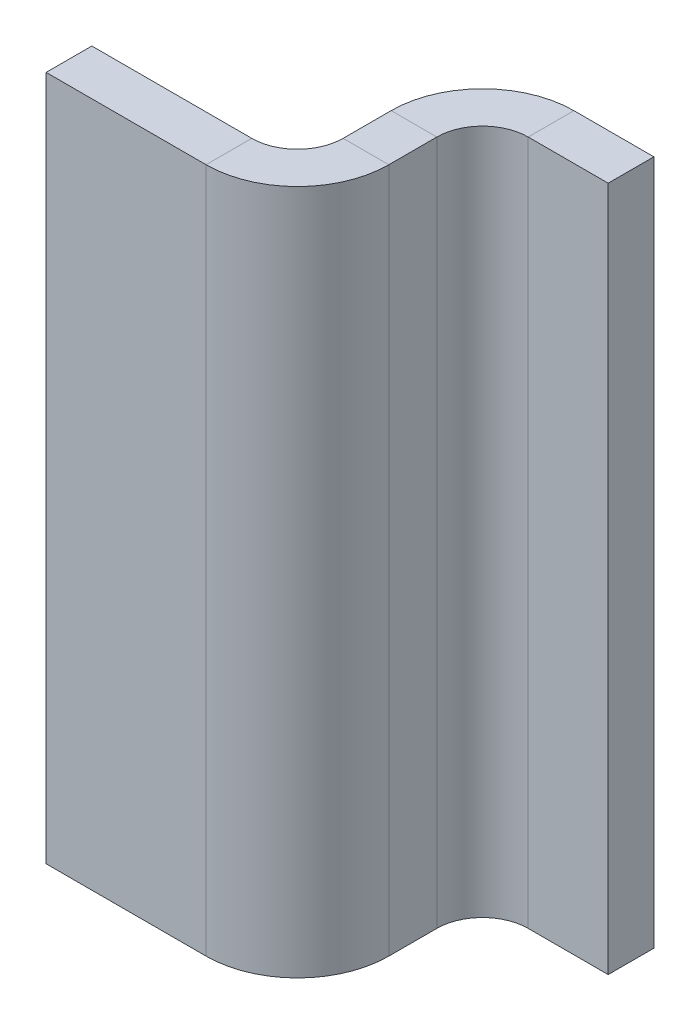
ISO-10303-21;
HEADER;
FILE_DESCRIPTION(('STEP AP214'),'2;1');
FILE_NAME('part.step','',(''),(''),'','','');
FILE_SCHEMA(('AUTOMOTIVE_DESIGN { 1 0 10303 214 1 1 1 1 }'));
ENDSEC;
DATA;
#1=APPLICATION_CONTEXT('core data for automotive mechanical design processes');
#2=APPLICATION_PROTOCOL_DEFINITION('international standard','automotive_design',2000,#1);
#3=PRODUCT_CONTEXT('',#1,'mechanical');
#4=PRODUCT('Part','Part','',(#3));
#5=PRODUCT_RELATED_PRODUCT_CATEGORY('part','',(#4));
#6=PRODUCT_DEFINITION_FORMATION('','',#4);
#7=PRODUCT_DEFINITION_CONTEXT('part definition',#1,'design');
#8=PRODUCT_DEFINITION('design','',#6,#7);
#9=PRODUCT_DEFINITION_SHAPE('','',#8);
#10=(LENGTH_UNIT() NAMED_UNIT(*) SI_UNIT(.MILLI.,.METRE.));
#11=(NAMED_UNIT(*) PLANE_ANGLE_UNIT() SI_UNIT($,.RADIAN.));
#12=(NAMED_UNIT(*) SI_UNIT($,.STERADIAN.) SOLID_ANGLE_UNIT());
#13=UNCERTAINTY_MEASURE_WITH_UNIT(LENGTH_MEASURE(1.E-05),#10,'distance_accuracy_value','');
#14=(GEOMETRIC_REPRESENTATION_CONTEXT(3) GLOBAL_UNCERTAINTY_ASSIGNED_CONTEXT((#13)) GLOBAL_UNIT_ASSIGNED_CONTEXT((#10,
#11,#12)) REPRESENTATION_CONTEXT('',''));
#15=CARTESIAN_POINT('',(0.,0.,0.));
#16=DIRECTION('',(0.,0.,1.));
#17=DIRECTION('',(1.,0.,0.));
#18=AXIS2_PLACEMENT_3D('',#15,#16,#17);
#19=CARTESIAN_POINT('',(0.,-1.5,0.81));
#20=DIRECTION('',(-1.,0.,0.));
#21=DIRECTION('',(0.,0.,-1.));
#22=AXIS2_PLACEMENT_3D('',#19,#20,#21);
#23=PLANE('',#22);
#24=DIRECTION('',(0.,0.,1.));
#25=VECTOR('',#24,1.);
#26=CARTESIAN_POINT('',(0.,-1.5,1.01));
#27=LINE('',#26,#25);
#28=CARTESIAN_POINT('',(0.,-1.5,0.81));
#29=VERTEX_POINT('',#28);
#30=CARTESIAN_POINT('',(0.,-1.5,1.01));
#31=VERTEX_POINT('',#30);
#32=EDGE_CURVE('E11',#29,#31,#27,.T.);
#33=ORIENTED_EDGE('',*,*,#32,.T.);
#34=DIRECTION('',(0.,1.,0.));
#35=VECTOR('',#34,1.);
#36=CARTESIAN_POINT('',(0.,1.5,1.01));
#37=LINE('',#36,#35);
#38=CARTESIAN_POINT('',(0.,1.5,1.01));
#39=VERTEX_POINT('',#38);
#40=EDGE_CURVE('E23',#31,#39,#37,.T.);
#41=ORIENTED_EDGE('',*,*,#40,.T.);
#42=DIRECTION('',(0.,0.,-1.));
#43=VECTOR('',#42,1.);
#44=CARTESIAN_POINT('',(0.,1.5,0.81));
#45=LINE('',#44,#43);
#46=CARTESIAN_POINT('',(0.,1.5,0.81));
#47=VERTEX_POINT('',#46);
#48=EDGE_CURVE('E216',#39,#47,#45,.T.);
#49=ORIENTED_EDGE('',*,*,#48,.T.);
#50=DIRECTION('',(0.,-1.,0.));
#51=VECTOR('',#50,1.);
#52=CARTESIAN_POINT('',(0.,-1.5,0.81));
#53=LINE('',#52,#51);
#54=EDGE_CURVE('E35',#47,#29,#53,.T.);
#55=ORIENTED_EDGE('',*,*,#54,.T.);
#56=EDGE_LOOP('',(#33,#41,#49,#55));
#57=FACE_BOUND('',#56,.T.);
#58=ADVANCED_FACE('F16',(#57),#23,.T.);
#59=CARTESIAN_POINT('',(0.,-1.5,0.81));
#60=DIRECTION('',(0.,0.,1.));
#61=DIRECTION('',(0.,-1.,0.));
#62=AXIS2_PLACEMENT_3D('',#59,#60,#61);
#63=PLANE('',#62);
#64=DIRECTION('',(0.,-1.,0.));
#65=VECTOR('',#64,1.);
#66=CARTESIAN_POINT('',(0.7,-1.5,0.81));
#67=LINE('',#66,#65);
#68=CARTESIAN_POINT('',(0.7,1.5,0.81));
#69=VERTEX_POINT('',#68);
#70=CARTESIAN_POINT('',(0.7,-1.5,0.81));
#71=VERTEX_POINT('',#70);
#72=EDGE_CURVE('E212',#69,#71,#67,.T.);
#73=ORIENTED_EDGE('',*,*,#72,.T.);
#74=DIRECTION('',(1.,0.,0.));
#75=VECTOR('',#74,1.);
#76=CARTESIAN_POINT('',(0.,-1.5,0.81));
#77=LINE('',#76,#75);
#78=EDGE_CURVE('E210',#29,#71,#77,.T.);
#79=ORIENTED_EDGE('',*,*,#78,.F.);
#80=ORIENTED_EDGE('',*,*,#54,.F.);
#81=DIRECTION('',(1.,0.,0.));
#82=VECTOR('',#81,1.);
#83=CARTESIAN_POINT('',(0.,1.5,0.81));
#84=LINE('',#83,#82);
#85=EDGE_CURVE('E208',#47,#69,#84,.T.);
#86=ORIENTED_EDGE('',*,*,#85,.T.);
#87=EDGE_LOOP('',(#73,#79,#80,#86));
#88=FACE_BOUND('',#87,.T.);
#89=ADVANCED_FACE('F227',(#88),#63,.F.);
#90=CARTESIAN_POINT('',(0.7,-1.5,0.61));
#91=DIRECTION('',(0.,1.,0.));
#92=DIRECTION('',(0.,0.,-1.));
#93=AXIS2_PLACEMENT_3D('',#90,#91,#92);
#94=CYLINDRICAL_SURFACE('',#93,0.2);
#95=DIRECTION('',(0.,1.,0.));
#96=VECTOR('',#95,1.);
#97=CARTESIAN_POINT('',(0.9,-1.5,0.61));
#98=LINE('',#97,#96);
#99=CARTESIAN_POINT('',(0.9,-1.5,0.61));
#100=VERTEX_POINT('',#99);
#101=CARTESIAN_POINT('',(0.9,1.5,0.61));
#102=VERTEX_POINT('',#101);
#103=EDGE_CURVE('E205',#100,#102,#98,.T.);
#104=ORIENTED_EDGE('',*,*,#103,.F.);
#105=CARTESIAN_POINT('',(0.7,-1.5,0.61));
#106=DIRECTION('',(0.,1.,0.));
#107=DIRECTION('',(0.,0.,-1.));
#108=AXIS2_PLACEMENT_3D('',#105,#106,#107);
#109=CIRCLE('',#108,0.2);
#110=EDGE_CURVE('E203',#71,#100,#109,.T.);
#111=ORIENTED_EDGE('',*,*,#110,.F.);
#112=ORIENTED_EDGE('',*,*,#72,.F.);
#113=CARTESIAN_POINT('',(0.7,1.5,0.61));
#114=DIRECTION('',(0.,1.,0.));
#115=DIRECTION('',(0.,0.,-1.));
#116=AXIS2_PLACEMENT_3D('',#113,#114,#115);
#117=CIRCLE('',#116,0.2);
#118=EDGE_CURVE('E201',#69,#102,#117,.T.);
#119=ORIENTED_EDGE('',*,*,#118,.T.);
#120=EDGE_LOOP('',(#104,#111,#112,#119));
#121=FACE_BOUND('',#120,.T.);
#122=ADVANCED_FACE('F233',(#121),#94,.F.);
#123=CARTESIAN_POINT('',(0.9,-1.5,0.61));
#124=DIRECTION('',(1.,0.,0.));
#125=DIRECTION('',(0.,-1.,0.));
#126=AXIS2_PLACEMENT_3D('',#123,#124,#125);
#127=PLANE('',#126);
#128=DIRECTION('',(0.,-1.,0.));
#129=VECTOR('',#128,1.);
#130=CARTESIAN_POINT('',(0.9,-1.5,0.4));
#131=LINE('',#130,#129);
#132=CARTESIAN_POINT('',(0.9,1.5,0.4));
#133=VERTEX_POINT('',#132);
#134=CARTESIAN_POINT('',(0.9,-1.5,0.4));
#135=VERTEX_POINT('',#134);
#136=EDGE_CURVE('E198',#133,#135,#131,.T.);
#137=ORIENTED_EDGE('',*,*,#136,.T.);
#138=DIRECTION('',(0.,0.,-1.));
#139=VECTOR('',#138,1.);
#140=CARTESIAN_POINT('',(0.9,-1.5,0.61));
#141=LINE('',#140,#139);
#142=EDGE_CURVE('E196',#100,#135,#141,.T.);
#143=ORIENTED_EDGE('',*,*,#142,.F.);
#144=ORIENTED_EDGE('',*,*,#103,.T.);
#145=DIRECTION('',(0.,0.,-1.));
#146=VECTOR('',#145,1.);
#147=CARTESIAN_POINT('',(0.9,1.5,0.61));
#148=LINE('',#147,#146);
#149=EDGE_CURVE('E194',#102,#133,#148,.T.);
#150=ORIENTED_EDGE('',*,*,#149,.T.);
#151=EDGE_LOOP('',(#137,#143,#144,#150));
#152=FACE_BOUND('',#151,.T.);
#153=ADVANCED_FACE('F245',(#152),#127,.F.);
#154=CARTESIAN_POINT('',(1.3,-1.5,0.4));
#155=DIRECTION('',(0.,-1.,0.));
#156=DIRECTION('',(0.,0.,-1.));
#157=AXIS2_PLACEMENT_3D('',#154,#155,#156);
#158=CYLINDRICAL_SURFACE('',#157,0.4);
#159=CARTESIAN_POINT('',(1.3,1.5,0.4));
#160=DIRECTION('',(0.,-1.,0.));
#161=DIRECTION('',(0.,0.,-1.));
#162=AXIS2_PLACEMENT_3D('',#159,#160,#161);
#163=CIRCLE('',#162,0.4);
#164=CARTESIAN_POINT('',(1.3,1.5,0.));
#165=VERTEX_POINT('',#164);
#166=EDGE_CURVE('E192',#133,#165,#163,.T.);
#167=ORIENTED_EDGE('',*,*,#166,.T.);
#168=DIRECTION('',(0.,-1.,0.));
#169=VECTOR('',#168,1.);
#170=CARTESIAN_POINT('',(1.3,-1.5,0.));
#171=LINE('',#170,#169);
#172=CARTESIAN_POINT('',(1.3,-1.5,0.));
#173=VERTEX_POINT('',#172);
#174=EDGE_CURVE('E190',#165,#173,#171,.T.);
#175=ORIENTED_EDGE('',*,*,#174,.T.);
#176=CARTESIAN_POINT('',(1.3,-1.5,0.4));
#177=DIRECTION('',(0.,-1.,0.));
#178=DIRECTION('',(0.,0.,-1.));
#179=AXIS2_PLACEMENT_3D('',#176,#177,#178);
#180=CIRCLE('',#179,0.4);
#181=EDGE_CURVE('E187',#135,#173,#180,.T.);
#182=ORIENTED_EDGE('',*,*,#181,.F.);
#183=ORIENTED_EDGE('',*,*,#136,.F.);
#184=EDGE_LOOP('',(#167,#175,#182,#183));
#185=FACE_BOUND('',#184,.T.);
#186=ADVANCED_FACE('F250',(#185),#158,.T.);
#187=CARTESIAN_POINT('',(1.3,-1.5,0.));
#188=DIRECTION('',(0.,0.,1.));
#189=DIRECTION('',(0.,-1.,0.));
#190=AXIS2_PLACEMENT_3D('',#187,#188,#189);
#191=PLANE('',#190);
#192=DIRECTION('',(0.,-1.,0.));
#193=VECTOR('',#192,1.);
#194=CARTESIAN_POINT('',(1.65,-1.5,0.));
#195=LINE('',#194,#193);
#196=CARTESIAN_POINT('',(1.65,1.5,0.));
#197=VERTEX_POINT('',#196);
#198=CARTESIAN_POINT('',(1.65,-1.5,0.));
#199=VERTEX_POINT('',#198);
#200=EDGE_CURVE('E129',#197,#199,#195,.T.);
#201=ORIENTED_EDGE('',*,*,#200,.T.);
#202=DIRECTION('',(1.,0.,0.));
#203=VECTOR('',#202,1.);
#204=CARTESIAN_POINT('',(1.3,-1.5,0.));
#205=LINE('',#204,#203);
#206=EDGE_CURVE('E184',#173,#199,#205,.T.);
#207=ORIENTED_EDGE('',*,*,#206,.F.);
#208=ORIENTED_EDGE('',*,*,#174,.F.);
#209=DIRECTION('',(1.,0.,0.));
#210=VECTOR('',#209,1.);
#211=CARTESIAN_POINT('',(1.3,1.5,0.));
#212=LINE('',#211,#210);
#213=EDGE_CURVE('E182',#165,#197,#212,.T.);
#214=ORIENTED_EDGE('',*,*,#213,.T.);
#215=EDGE_LOOP('',(#201,#207,#208,#214));
#216=FACE_BOUND('',#215,.T.);
#217=ADVANCED_FACE('F267',(#216),#191,.F.);
#218=CARTESIAN_POINT('',(0.,-1.5,1.01));
#219=DIRECTION('',(0.,1.,0.));
#220=DIRECTION('',(0.,0.,1.));
#221=AXIS2_PLACEMENT_3D('',#218,#219,#220);
#222=PLANE('',#221);
#223=DIRECTION('',(0.,0.,1.));
#224=VECTOR('',#223,1.);
#225=CARTESIAN_POINT('',(0.7,-1.5,1.01));
#226=LINE('',#225,#224);
#227=CARTESIAN_POINT('',(0.7,-1.5,1.01));
#228=VERTEX_POINT('',#227);
#229=EDGE_CURVE('E179',#71,#228,#226,.T.);
#230=ORIENTED_EDGE('',*,*,#229,.T.);
#231=DIRECTION('',(1.,0.,0.));
#232=VECTOR('',#231,1.);
#233=CARTESIAN_POINT('',(0.,-1.5,1.01));
#234=LINE('',#233,#232);
#235=EDGE_CURVE('E177',#31,#228,#234,.T.);
#236=ORIENTED_EDGE('',*,*,#235,.F.);
#237=ORIENTED_EDGE('',*,*,#32,.F.);
#238=ORIENTED_EDGE('',*,*,#78,.T.);
#239=EDGE_LOOP('',(#230,#236,#237,#238));
#240=FACE_BOUND('',#239,.T.);
#241=ADVANCED_FACE('F305',(#240),#222,.F.);
#242=CARTESIAN_POINT('',(0.912132034356,-1.5,0.822132034356));
#243=DIRECTION('',(0.,-1.,0.));
#244=DIRECTION('',(0.707106781186548,0.,-0.707106781186548));
#245=AXIS2_PLACEMENT_3D('',#242,#243,#244);
#246=PLANE('',#245);
#247=ORIENTED_EDGE('',*,*,#110,.T.);
#248=DIRECTION('',(1.,0.,0.));
#249=VECTOR('',#248,1.);
#250=CARTESIAN_POINT('',(1.1,-1.5,0.61));
#251=LINE('',#250,#249);
#252=CARTESIAN_POINT('',(1.1,-1.5,0.61));
#253=VERTEX_POINT('',#252);
#254=EDGE_CURVE('E175',#100,#253,#251,.T.);
#255=ORIENTED_EDGE('',*,*,#254,.T.);
#256=CARTESIAN_POINT('',(0.7,-1.5,0.61));
#257=DIRECTION('',(0.,1.,0.));
#258=DIRECTION('',(0.,0.,-1.));
#259=AXIS2_PLACEMENT_3D('',#256,#257,#258);
#260=CIRCLE('',#259,0.4);
#261=EDGE_CURVE('E172',#228,#253,#260,.T.);
#262=ORIENTED_EDGE('',*,*,#261,.F.);
#263=ORIENTED_EDGE('',*,*,#229,.F.);
#264=EDGE_LOOP('',(#247,#255,#262,#263));
#265=FACE_BOUND('',#264,.T.);
#266=ADVANCED_FACE('F276',(#265),#246,.T.);
#267=CARTESIAN_POINT('',(1.1,-1.5,0.61));
#268=DIRECTION('',(0.,1.,0.));
#269=DIRECTION('',(1.,0.,0.));
#270=AXIS2_PLACEMENT_3D('',#267,#268,#269);
#271=PLANE('',#270);
#272=DIRECTION('',(1.,0.,0.));
#273=VECTOR('',#272,1.);
#274=CARTESIAN_POINT('',(1.1,-1.5,0.4));
#275=LINE('',#274,#273);
#276=CARTESIAN_POINT('',(1.1,-1.5,0.4));
#277=VERTEX_POINT('',#276);
#278=EDGE_CURVE('E169',#135,#277,#275,.T.);
#279=ORIENTED_EDGE('',*,*,#278,.T.);
#280=DIRECTION('',(0.,0.,-1.));
#281=VECTOR('',#280,1.);
#282=CARTESIAN_POINT('',(1.1,-1.5,0.61));
#283=LINE('',#282,#281);
#284=EDGE_CURVE('E167',#253,#277,#283,.T.);
#285=ORIENTED_EDGE('',*,*,#284,.F.);
#286=ORIENTED_EDGE('',*,*,#254,.F.);
#287=ORIENTED_EDGE('',*,*,#142,.T.);
#288=EDGE_LOOP('',(#279,#285,#286,#287));
#289=FACE_BOUND('',#288,.T.);
#290=ADVANCED_FACE('F271',(#289),#271,.F.);
#291=CARTESIAN_POINT('',(1.087867965644,-1.5,0.187867965644));
#292=DIRECTION('',(0.,-1.,0.));
#293=DIRECTION('',(0.707106781186548,0.,-0.707106781186548));
#294=AXIS2_PLACEMENT_3D('',#291,#292,#293);
#295=PLANE('',#294);
#296=ORIENTED_EDGE('',*,*,#181,.T.);
#297=DIRECTION('',(0.,0.,1.));
#298=VECTOR('',#297,1.);
#299=CARTESIAN_POINT('',(1.3,-1.5,0.2));
#300=LINE('',#299,#298);
#301=CARTESIAN_POINT('',(1.3,-1.5,0.2));
#302=VERTEX_POINT('',#301);
#303=EDGE_CURVE('E165',#173,#302,#300,.T.);
#304=ORIENTED_EDGE('',*,*,#303,.T.);
#305=CARTESIAN_POINT('',(1.3,-1.5,0.4));
#306=DIRECTION('',(0.,-1.,0.));
#307=DIRECTION('',(0.,0.,-1.));
#308=AXIS2_PLACEMENT_3D('',#305,#306,#307);
#309=CIRCLE('',#308,0.2);
#310=EDGE_CURVE('E162',#277,#302,#309,.T.);
#311=ORIENTED_EDGE('',*,*,#310,.F.);
#312=ORIENTED_EDGE('',*,*,#278,.F.);
#313=EDGE_LOOP('',(#296,#304,#311,#312));
#314=FACE_BOUND('',#313,.T.);
#315=ADVANCED_FACE('F268',(#314),#295,.T.);
#316=CARTESIAN_POINT('',(1.3,-1.5,0.2));
#317=DIRECTION('',(0.,1.,0.));
#318=DIRECTION('',(0.,0.,1.));
#319=AXIS2_PLACEMENT_3D('',#316,#317,#318);
#320=PLANE('',#319);
#321=DIRECTION('',(0.,0.,1.));
#322=VECTOR('',#321,1.);
#323=CARTESIAN_POINT('',(1.65,-1.5,0.2));
#324=LINE('',#323,#322);
#325=CARTESIAN_POINT('',(1.65,-1.5,0.2));
#326=VERTEX_POINT('',#325);
#327=EDGE_CURVE('E160',#199,#326,#324,.T.);
#328=ORIENTED_EDGE('',*,*,#327,.T.);
#329=DIRECTION('',(1.,0.,0.));
#330=VECTOR('',#329,1.);
#331=CARTESIAN_POINT('',(1.3,-1.5,0.2));
#332=LINE('',#331,#330);
#333=EDGE_CURVE('E120',#302,#326,#332,.T.);
#334=ORIENTED_EDGE('',*,*,#333,.F.);
#335=ORIENTED_EDGE('',*,*,#303,.F.);
#336=ORIENTED_EDGE('',*,*,#206,.T.);
#337=EDGE_LOOP('',(#328,#334,#335,#336));
#338=FACE_BOUND('',#337,.T.);
#339=ADVANCED_FACE('F264',(#338),#320,.F.);
#340=CARTESIAN_POINT('',(0.,1.5,1.01));
#341=DIRECTION('',(0.,0.,-1.));
#342=DIRECTION('',(0.,1.,0.));
#343=AXIS2_PLACEMENT_3D('',#340,#341,#342);
#344=PLANE('',#343);
#345=DIRECTION('',(0.,1.,0.));
#346=VECTOR('',#345,1.);
#347=CARTESIAN_POINT('',(0.7,1.5,1.01));
#348=LINE('',#347,#346);
#349=CARTESIAN_POINT('',(0.7,1.5,1.01));
#350=VERTEX_POINT('',#349);
#351=EDGE_CURVE('E156',#228,#350,#348,.T.);
#352=ORIENTED_EDGE('',*,*,#351,.T.);
#353=DIRECTION('',(1.,0.,0.));
#354=VECTOR('',#353,1.);
#355=CARTESIAN_POINT('',(0.,1.5,1.01));
#356=LINE('',#355,#354);
#357=EDGE_CURVE('E154',#39,#350,#356,.T.);
#358=ORIENTED_EDGE('',*,*,#357,.F.);
#359=ORIENTED_EDGE('',*,*,#40,.F.);
#360=ORIENTED_EDGE('',*,*,#235,.T.);
#361=EDGE_LOOP('',(#352,#358,#359,#360));
#362=FACE_BOUND('',#361,.T.);
#363=ADVANCED_FACE('F219',(#362),#344,.F.);
#364=CARTESIAN_POINT('',(0.7,1.5,0.61));
#365=DIRECTION('',(0.,1.,0.));
#366=DIRECTION('',(0.,0.,-1.));
#367=AXIS2_PLACEMENT_3D('',#364,#365,#366);
#368=CYLINDRICAL_SURFACE('',#367,0.4);
#369=ORIENTED_EDGE('',*,*,#261,.T.);
#370=DIRECTION('',(0.,1.,0.));
#371=VECTOR('',#370,1.);
#372=CARTESIAN_POINT('',(1.1,1.5,0.61));
#373=LINE('',#372,#371);
#374=CARTESIAN_POINT('',(1.1,1.5,0.61));
#375=VERTEX_POINT('',#374);
#376=EDGE_CURVE('E152',#253,#375,#373,.T.);
#377=ORIENTED_EDGE('',*,*,#376,.T.);
#378=CARTESIAN_POINT('',(0.7,1.5,0.61));
#379=DIRECTION('',(0.,1.,0.));
#380=DIRECTION('',(0.,0.,-1.));
#381=AXIS2_PLACEMENT_3D('',#378,#379,#380);
#382=CIRCLE('',#381,0.4);
#383=EDGE_CURVE('E149',#350,#375,#382,.T.);
#384=ORIENTED_EDGE('',*,*,#383,.F.);
#385=ORIENTED_EDGE('',*,*,#351,.F.);
#386=EDGE_LOOP('',(#369,#377,#384,#385));
#387=FACE_BOUND('',#386,.T.);
#388=ADVANCED_FACE('F278',(#387),#368,.T.);
#389=CARTESIAN_POINT('',(1.1,1.5,0.61));
#390=DIRECTION('',(-1.,0.,0.));
#391=DIRECTION('',(0.,1.,0.));
#392=AXIS2_PLACEMENT_3D('',#389,#390,#391);
#393=PLANE('',#392);
#394=DIRECTION('',(0.,1.,0.));
#395=VECTOR('',#394,1.);
#396=CARTESIAN_POINT('',(1.1,1.5,0.4));
#397=LINE('',#396,#395);
#398=CARTESIAN_POINT('',(1.1,1.5,0.4));
#399=VERTEX_POINT('',#398);
#400=EDGE_CURVE('E146',#277,#399,#397,.T.);
#401=ORIENTED_EDGE('',*,*,#400,.T.);
#402=DIRECTION('',(0.,0.,-1.));
#403=VECTOR('',#402,1.);
#404=CARTESIAN_POINT('',(1.1,1.5,0.61));
#405=LINE('',#404,#403);
#406=EDGE_CURVE('E144',#375,#399,#405,.T.);
#407=ORIENTED_EDGE('',*,*,#406,.F.);
#408=ORIENTED_EDGE('',*,*,#376,.F.);
#409=ORIENTED_EDGE('',*,*,#284,.T.);
#410=EDGE_LOOP('',(#401,#407,#408,#409));
#411=FACE_BOUND('',#410,.T.);
#412=ADVANCED_FACE('F280',(#411),#393,.F.);
#413=CARTESIAN_POINT('',(1.3,1.5,0.4));
#414=DIRECTION('',(0.,-1.,0.));
#415=DIRECTION('',(0.,0.,-1.));
#416=AXIS2_PLACEMENT_3D('',#413,#414,#415);
#417=CYLINDRICAL_SURFACE('',#416,0.2);
#418=DIRECTION('',(0.,-1.,0.));
#419=VECTOR('',#418,1.);
#420=CARTESIAN_POINT('',(1.3,1.5,0.2));
#421=LINE('',#420,#419);
#422=CARTESIAN_POINT('',(1.3,1.5,0.2));
#423=VERTEX_POINT('',#422);
#424=EDGE_CURVE('E142',#423,#302,#421,.T.);
#425=ORIENTED_EDGE('',*,*,#424,.F.);
#426=CARTESIAN_POINT('',(1.3,1.5,0.4));
#427=DIRECTION('',(0.,-1.,0.));
#428=DIRECTION('',(0.,0.,-1.));
#429=AXIS2_PLACEMENT_3D('',#426,#427,#428);
#430=CIRCLE('',#429,0.2);
#431=EDGE_CURVE('E124',#399,#423,#430,.T.);
#432=ORIENTED_EDGE('',*,*,#431,.F.);
#433=ORIENTED_EDGE('',*,*,#400,.F.);
#434=ORIENTED_EDGE('',*,*,#310,.T.);
#435=EDGE_LOOP('',(#425,#432,#433,#434));
#436=FACE_BOUND('',#435,.T.);
#437=ADVANCED_FACE('F259',(#436),#417,.F.);
#438=CARTESIAN_POINT('',(1.3,1.5,0.2));
#439=DIRECTION('',(0.,0.,-1.));
#440=DIRECTION('',(0.,1.,0.));
#441=AXIS2_PLACEMENT_3D('',#438,#439,#440);
#442=PLANE('',#441);
#443=DIRECTION('',(0.,1.,0.));
#444=VECTOR('',#443,1.);
#445=CARTESIAN_POINT('',(1.65,1.5,0.2));
#446=LINE('',#445,#444);
#447=CARTESIAN_POINT('',(1.65,1.5,0.2));
#448=VERTEX_POINT('',#447);
#449=EDGE_CURVE('E114',#326,#448,#446,.T.);
#450=ORIENTED_EDGE('',*,*,#449,.T.);
#451=DIRECTION('',(1.,0.,0.));
#452=VECTOR('',#451,1.);
#453=CARTESIAN_POINT('',(1.3,1.5,0.2));
#454=LINE('',#453,#452);
#455=EDGE_CURVE('E104',#423,#448,#454,.T.);
#456=ORIENTED_EDGE('',*,*,#455,.F.);
#457=ORIENTED_EDGE('',*,*,#424,.T.);
#458=ORIENTED_EDGE('',*,*,#333,.T.);
#459=EDGE_LOOP('',(#450,#456,#457,#458));
#460=FACE_BOUND('',#459,.T.);
#461=ADVANCED_FACE('F118',(#460),#442,.F.);
#462=CARTESIAN_POINT('',(0.,1.5,0.81));
#463=DIRECTION('',(0.,-1.,0.));
#464=DIRECTION('',(0.,0.,-1.));
#465=AXIS2_PLACEMENT_3D('',#462,#463,#464);
#466=PLANE('',#465);
#467=DIRECTION('',(0.,0.,-1.));
#468=VECTOR('',#467,1.);
#469=CARTESIAN_POINT('',(0.7,1.5,0.81));
#470=LINE('',#469,#468);
#471=EDGE_CURVE('E115',#350,#69,#470,.T.);
#472=ORIENTED_EDGE('',*,*,#471,.T.);
#473=ORIENTED_EDGE('',*,*,#85,.F.);
#474=ORIENTED_EDGE('',*,*,#48,.F.);
#475=ORIENTED_EDGE('',*,*,#357,.T.);
#476=EDGE_LOOP('',(#472,#473,#474,#475));
#477=FACE_BOUND('',#476,.T.);
#478=ADVANCED_FACE('F223',(#477),#466,.F.);
#479=CARTESIAN_POINT('',(0.912132034356,1.5,0.822132034356));
#480=DIRECTION('',(0.,1.,0.));
#481=DIRECTION('',(0.707106781186548,0.,-0.707106781186548));
#482=AXIS2_PLACEMENT_3D('',#479,#480,#481);
#483=PLANE('',#482);
#484=ORIENTED_EDGE('',*,*,#383,.T.);
#485=DIRECTION('',(-1.,0.,0.));
#486=VECTOR('',#485,1.);
#487=CARTESIAN_POINT('',(0.9,1.5,0.61));
#488=LINE('',#487,#486);
#489=EDGE_CURVE('E136',#375,#102,#488,.T.);
#490=ORIENTED_EDGE('',*,*,#489,.T.);
#491=ORIENTED_EDGE('',*,*,#118,.F.);
#492=ORIENTED_EDGE('',*,*,#471,.F.);
#493=EDGE_LOOP('',(#484,#490,#491,#492));
#494=FACE_BOUND('',#493,.T.);
#495=ADVANCED_FACE('F236',(#494),#483,.T.);
#496=CARTESIAN_POINT('',(0.9,1.5,0.61));
#497=DIRECTION('',(0.,-1.,0.));
#498=DIRECTION('',(-1.,0.,0.));
#499=AXIS2_PLACEMENT_3D('',#496,#497,#498);
#500=PLANE('',#499);
#501=DIRECTION('',(-1.,0.,0.));
#502=VECTOR('',#501,1.);
#503=CARTESIAN_POINT('',(0.9,1.5,0.4));
#504=LINE('',#503,#502);
#505=EDGE_CURVE('E131',#399,#133,#504,.T.);
#506=ORIENTED_EDGE('',*,*,#505,.T.);
#507=ORIENTED_EDGE('',*,*,#149,.F.);
#508=ORIENTED_EDGE('',*,*,#489,.F.);
#509=ORIENTED_EDGE('',*,*,#406,.T.);
#510=EDGE_LOOP('',(#506,#507,#508,#509));
#511=FACE_BOUND('',#510,.T.);
#512=ADVANCED_FACE('F241',(#511),#500,.F.);
#513=CARTESIAN_POINT('',(1.087867965644,1.5,0.187867965644));
#514=DIRECTION('',(0.,1.,0.));
#515=DIRECTION('',(0.707106781186548,0.,-0.707106781186548));
#516=AXIS2_PLACEMENT_3D('',#513,#514,#515);
#517=PLANE('',#516);
#518=ORIENTED_EDGE('',*,*,#431,.T.);
#519=DIRECTION('',(0.,0.,-1.));
#520=VECTOR('',#519,1.);
#521=CARTESIAN_POINT('',(1.3,1.5,0.));
#522=LINE('',#521,#520);
#523=EDGE_CURVE('E111',#423,#165,#522,.T.);
#524=ORIENTED_EDGE('',*,*,#523,.T.);
#525=ORIENTED_EDGE('',*,*,#166,.F.);
#526=ORIENTED_EDGE('',*,*,#505,.F.);
#527=EDGE_LOOP('',(#518,#524,#525,#526));
#528=FACE_BOUND('',#527,.T.);
#529=ADVANCED_FACE('F254',(#528),#517,.T.);
#530=CARTESIAN_POINT('',(1.3,1.5,0.));
#531=DIRECTION('',(0.,-1.,0.));
#532=DIRECTION('',(0.,0.,-1.));
#533=AXIS2_PLACEMENT_3D('',#530,#531,#532);
#534=PLANE('',#533);
#535=DIRECTION('',(0.,0.,-1.));
#536=VECTOR('',#535,1.);
#537=CARTESIAN_POINT('',(1.65,1.5,0.));
#538=LINE('',#537,#536);
#539=EDGE_CURVE('E109',#448,#197,#538,.T.);
#540=ORIENTED_EDGE('',*,*,#539,.T.);
#541=ORIENTED_EDGE('',*,*,#213,.F.);
#542=ORIENTED_EDGE('',*,*,#523,.F.);
#543=ORIENTED_EDGE('',*,*,#455,.T.);
#544=EDGE_LOOP('',(#540,#541,#542,#543));
#545=FACE_BOUND('',#544,.T.);
#546=ADVANCED_FACE('F106',(#545),#534,.F.);
#547=CARTESIAN_POINT('',(1.65,-1.5,0.));
#548=DIRECTION('',(-1.,0.,0.));
#549=DIRECTION('',(0.,0.,-1.));
#550=AXIS2_PLACEMENT_3D('',#547,#548,#549);
#551=PLANE('',#550);
#552=ORIENTED_EDGE('',*,*,#200,.F.);
#553=ORIENTED_EDGE('',*,*,#539,.F.);
#554=ORIENTED_EDGE('',*,*,#449,.F.);
#555=ORIENTED_EDGE('',*,*,#327,.F.);
#556=EDGE_LOOP('',(#552,#553,#554,#555));
#557=FACE_BOUND('',#556,.T.);
#558=ADVANCED_FACE('F127',(#557),#551,.F.);
#559=CLOSED_SHELL('',(#58,#89,#122,#153,#186,#217,#241,#266,#290,#315,#339,#363,#388,#412,#437,
#461,#478,#495,#512,#529,#546,#558));
#560=MANIFOLD_SOLID_BREP('B1',#559);
#561=ADVANCED_BREP_SHAPE_REPRESENTATION('',(#18,#560),#14);
#562=SHAPE_DEFINITION_REPRESENTATION(#9,#561);
ENDSEC;
END-ISO-10303-21;
